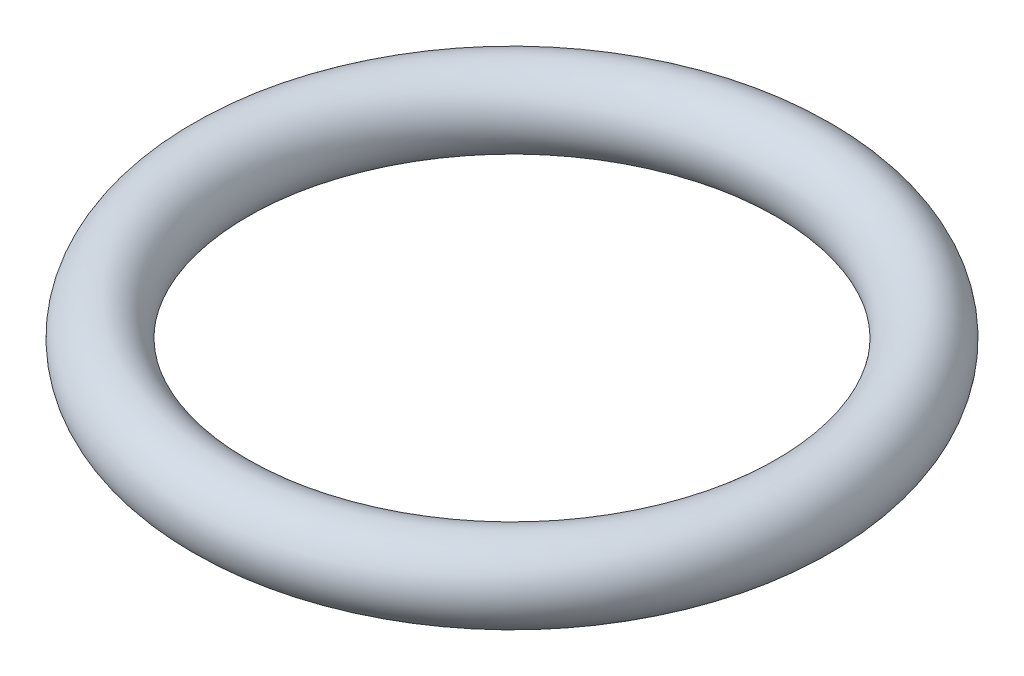
ISO-10303-21;
HEADER;
FILE_DESCRIPTION(('STEP AP214'),'2;1');
FILE_NAME('part.step','',(''),(''),'','','');
FILE_SCHEMA(('AUTOMOTIVE_DESIGN { 1 0 10303 214 1 1 1 1 }'));
ENDSEC;
DATA;
#1=APPLICATION_CONTEXT('core data for automotive mechanical design processes');
#2=APPLICATION_PROTOCOL_DEFINITION('international standard','automotive_design',2000,#1);
#3=PRODUCT_CONTEXT('',#1,'mechanical');
#4=PRODUCT('Part','Part','',(#3));
#5=PRODUCT_RELATED_PRODUCT_CATEGORY('part','',(#4));
#6=PRODUCT_DEFINITION_FORMATION('','',#4);
#7=PRODUCT_DEFINITION_CONTEXT('part definition',#1,'design');
#8=PRODUCT_DEFINITION('design','',#6,#7);
#9=PRODUCT_DEFINITION_SHAPE('','',#8);
#10=(LENGTH_UNIT() NAMED_UNIT(*) SI_UNIT(.MILLI.,.METRE.));
#11=(NAMED_UNIT(*) PLANE_ANGLE_UNIT() SI_UNIT($,.RADIAN.));
#12=(NAMED_UNIT(*) SI_UNIT($,.STERADIAN.) SOLID_ANGLE_UNIT());
#13=UNCERTAINTY_MEASURE_WITH_UNIT(LENGTH_MEASURE(1.E-05),#10,'distance_accuracy_value','');
#14=(GEOMETRIC_REPRESENTATION_CONTEXT(3) GLOBAL_UNCERTAINTY_ASSIGNED_CONTEXT((#13)) GLOBAL_UNIT_ASSIGNED_CONTEXT((#10,
#11,#12)) REPRESENTATION_CONTEXT('',''));
#15=CARTESIAN_POINT('',(0.,0.,0.));
#16=DIRECTION('',(0.,0.,1.));
#17=DIRECTION('',(1.,0.,0.));
#18=AXIS2_PLACEMENT_3D('',#15,#16,#17);
#19=CARTESIAN_POINT('',(0.,0.,0.));
#20=DIRECTION('',(0.,-1.,0.));
#21=DIRECTION('',(0.,0.,-1.));
#22=AXIS2_PLACEMENT_3D('',#19,#20,#21);
#23=TOROIDAL_SURFACE('',#22,13.465,1.765);
#24=CARTESIAN_POINT('',(0.,0.,-15.23));
#25=VERTEX_POINT('',#24);
#26=VERTEX_LOOP('',#25);
#27=FACE_BOUND('',#26,.T.);
#28=ADVANCED_FACE('F41',(#27),#23,.T.);
#29=CLOSED_SHELL('',(#28));
#30=MANIFOLD_SOLID_BREP('B2',#29);
#31=ADVANCED_BREP_SHAPE_REPRESENTATION('',(#18,#30),#14);
#32=SHAPE_DEFINITION_REPRESENTATION(#9,#31);
ENDSEC;
END-ISO-10303-21;
